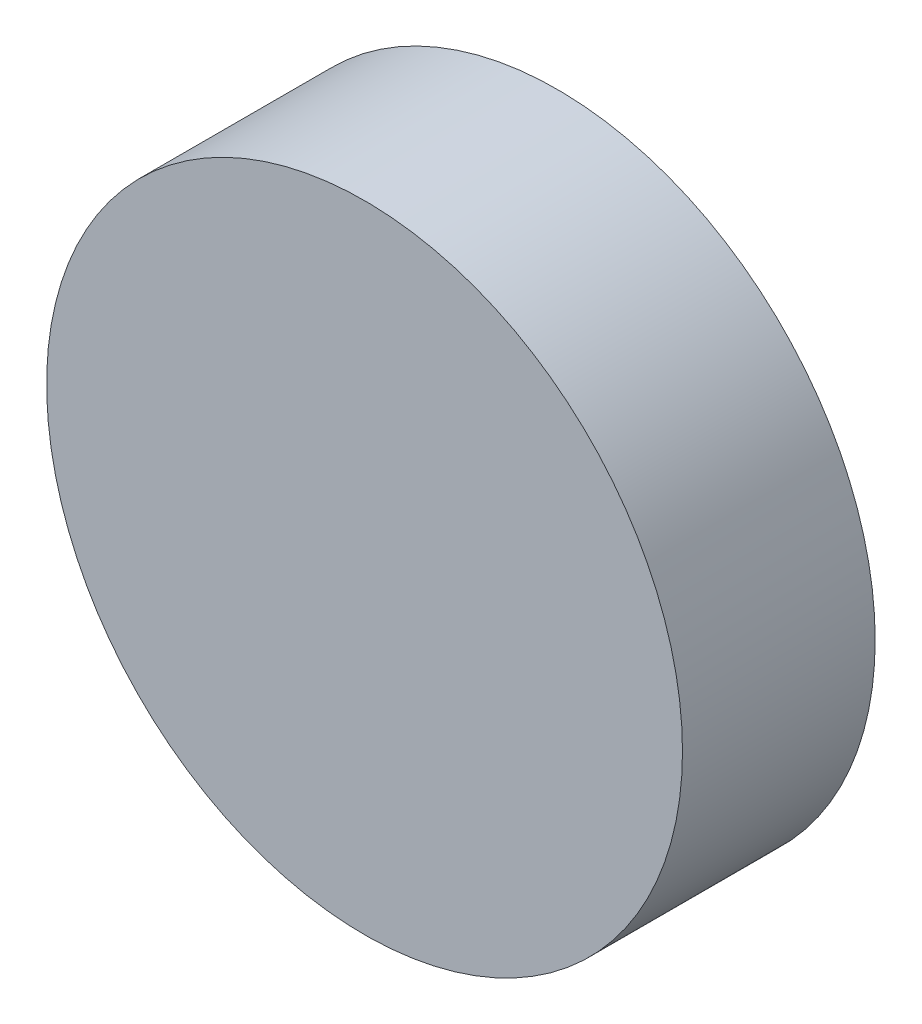
ISO-10303-21;
HEADER;
FILE_DESCRIPTION(('STEP AP214'),'2;1');
FILE_NAME('part.step','',(''),(''),'','','');
FILE_SCHEMA(('AUTOMOTIVE_DESIGN { 1 0 10303 214 1 1 1 1 }'));
ENDSEC;
DATA;
#1=APPLICATION_CONTEXT('core data for automotive mechanical design processes');
#2=APPLICATION_PROTOCOL_DEFINITION('international standard','automotive_design',2000,#1);
#3=PRODUCT_CONTEXT('',#1,'mechanical');
#4=PRODUCT('Part','Part','',(#3));
#5=PRODUCT_RELATED_PRODUCT_CATEGORY('part','',(#4));
#6=PRODUCT_DEFINITION_FORMATION('','',#4);
#7=PRODUCT_DEFINITION_CONTEXT('part definition',#1,'design');
#8=PRODUCT_DEFINITION('design','',#6,#7);
#9=PRODUCT_DEFINITION_SHAPE('','',#8);
#10=(LENGTH_UNIT() NAMED_UNIT(*) SI_UNIT(.MILLI.,.METRE.));
#11=(NAMED_UNIT(*) PLANE_ANGLE_UNIT() SI_UNIT($,.RADIAN.));
#12=(NAMED_UNIT(*) SI_UNIT($,.STERADIAN.) SOLID_ANGLE_UNIT());
#13=UNCERTAINTY_MEASURE_WITH_UNIT(LENGTH_MEASURE(1.E-05),#10,'distance_accuracy_value','');
#14=(GEOMETRIC_REPRESENTATION_CONTEXT(3) GLOBAL_UNCERTAINTY_ASSIGNED_CONTEXT((#13)) GLOBAL_UNIT_ASSIGNED_CONTEXT((#10,
#11,#12)) REPRESENTATION_CONTEXT('',''));
#15=CARTESIAN_POINT('',(0.,0.,0.));
#16=DIRECTION('',(0.,0.,1.));
#17=DIRECTION('',(1.,0.,0.));
#18=AXIS2_PLACEMENT_3D('',#15,#16,#17);
#19=CARTESIAN_POINT('',(26.381395774766,23.792750998365,1.602));
#20=DIRECTION('',(0.,0.,1.));
#21=DIRECTION('',(1.,0.,0.));
#22=AXIS2_PLACEMENT_3D('',#19,#20,#21);
#23=PLANE('',#22);
#24=CARTESIAN_POINT('',(26.381395774766,23.792750998365,1.602));
#25=DIRECTION('',(0.,0.,1.));
#26=DIRECTION('',(1.,0.,0.));
#27=AXIS2_PLACEMENT_3D('',#24,#25,#26);
#28=CIRCLE('',#27,0.164991148023);
#29=CARTESIAN_POINT('',(26.546386922789,23.792750998365,1.602));
#30=VERTEX_POINT('',#29);
#31=EDGE_CURVE('E18',#30,#30,#28,.F.);
#32=ORIENTED_EDGE('',*,*,#31,.F.);
#33=EDGE_LOOP('',(#32));
#34=FACE_BOUND('',#33,.T.);
#35=ADVANCED_FACE('F15',(#34),#23,.T.);
#36=CARTESIAN_POINT('',(26.381395774766,23.792750998365,1.502));
#37=DIRECTION('',(0.,0.,1.));
#38=DIRECTION('',(1.,0.,0.));
#39=AXIS2_PLACEMENT_3D('',#36,#37,#38);
#40=PLANE('',#39);
#41=CARTESIAN_POINT('',(26.381395774766,23.792750998365,1.502));
#42=DIRECTION('',(0.,0.,1.));
#43=DIRECTION('',(1.,0.,0.));
#44=AXIS2_PLACEMENT_3D('',#41,#42,#43);
#45=CIRCLE('',#44,0.164991148023);
#46=CARTESIAN_POINT('',(26.546386922789,23.792750998365,1.502));
#47=VERTEX_POINT('',#46);
#48=EDGE_CURVE('E10',#47,#47,#45,.T.);
#49=ORIENTED_EDGE('',*,*,#48,.F.);
#50=EDGE_LOOP('',(#49));
#51=FACE_BOUND('',#50,.T.);
#52=ADVANCED_FACE('F30',(#51),#40,.F.);
#53=CARTESIAN_POINT('',(26.381395774766,23.792750998365,1.502));
#54=DIRECTION('',(0.,0.,1.));
#55=DIRECTION('',(1.,0.,0.));
#56=AXIS2_PLACEMENT_3D('',#53,#54,#55);
#57=CYLINDRICAL_SURFACE('',#56,0.164991148023);
#58=ORIENTED_EDGE('',*,*,#48,.T.);
#59=EDGE_LOOP('',(#58));
#60=FACE_BOUND('',#59,.T.);
#61=ORIENTED_EDGE('',*,*,#31,.T.);
#62=EDGE_LOOP('',(#61));
#63=FACE_BOUND('',#62,.T.);
#64=ADVANCED_FACE('F27',(#60,#63),#57,.T.);
#65=CLOSED_SHELL('',(#35,#52,#64));
#66=MANIFOLD_SOLID_BREP('B1',#65);
#67=ADVANCED_BREP_SHAPE_REPRESENTATION('',(#18,#66),#14);
#68=SHAPE_DEFINITION_REPRESENTATION(#9,#67);
ENDSEC;
END-ISO-10303-21;
